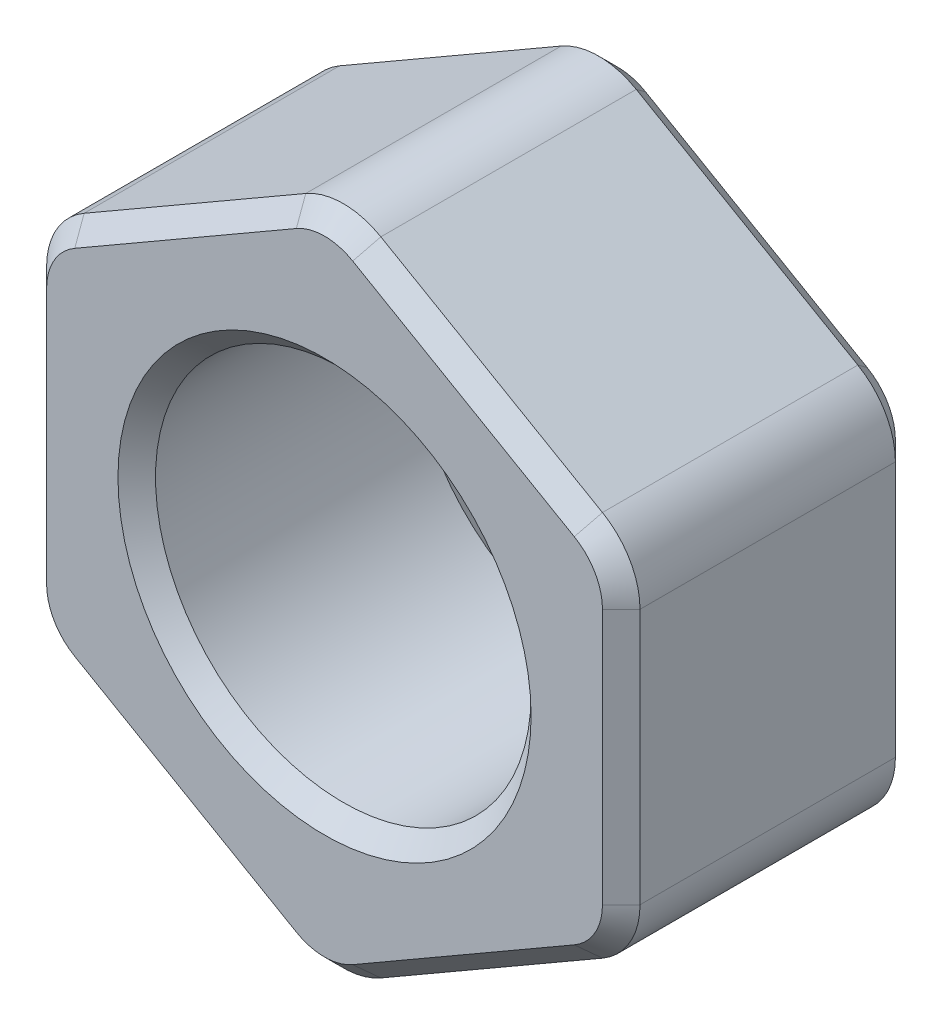
ISO-10303-21;
HEADER;
FILE_DESCRIPTION(('STEP AP214'),'2;1');
FILE_NAME('part.step','',(''),(''),'','','');
FILE_SCHEMA(('AUTOMOTIVE_DESIGN { 1 0 10303 214 1 1 1 1 }'));
ENDSEC;
DATA;
#1=APPLICATION_CONTEXT('core data for automotive mechanical design processes');
#2=APPLICATION_PROTOCOL_DEFINITION('international standard','automotive_design',2000,#1);
#3=PRODUCT_CONTEXT('',#1,'mechanical');
#4=PRODUCT('Part','Part','',(#3));
#5=PRODUCT_RELATED_PRODUCT_CATEGORY('part','',(#4));
#6=PRODUCT_DEFINITION_FORMATION('','',#4);
#7=PRODUCT_DEFINITION_CONTEXT('part definition',#1,'design');
#8=PRODUCT_DEFINITION('design','',#6,#7);
#9=PRODUCT_DEFINITION_SHAPE('','',#8);
#10=(LENGTH_UNIT() NAMED_UNIT(*) SI_UNIT(.MILLI.,.METRE.));
#11=(NAMED_UNIT(*) PLANE_ANGLE_UNIT() SI_UNIT($,.RADIAN.));
#12=(NAMED_UNIT(*) SI_UNIT($,.STERADIAN.) SOLID_ANGLE_UNIT());
#13=UNCERTAINTY_MEASURE_WITH_UNIT(LENGTH_MEASURE(1.E-05),#10,'distance_accuracy_value','');
#14=(GEOMETRIC_REPRESENTATION_CONTEXT(3) GLOBAL_UNCERTAINTY_ASSIGNED_CONTEXT((#13)) GLOBAL_UNIT_ASSIGNED_CONTEXT((#10,
#11,#12)) REPRESENTATION_CONTEXT('',''));
#15=CARTESIAN_POINT('',(0.,0.,0.));
#16=DIRECTION('',(0.,0.,1.));
#17=DIRECTION('',(1.,0.,0.));
#18=AXIS2_PLACEMENT_3D('',#15,#16,#17);
#19=CARTESIAN_POINT('',(0.,0.,3.9));
#20=DIRECTION('',(0.,0.,1.));
#21=DIRECTION('',(1.,0.,0.));
#22=AXIS2_PLACEMENT_3D('',#19,#20,#21);
#23=PLANE('',#22);
#24=CARTESIAN_POINT('',(0.,0.,3.9));
#25=DIRECTION('',(0.,0.,1.));
#26=DIRECTION('',(1.,0.,0.));
#27=AXIS2_PLACEMENT_3D('',#24,#25,#26);
#28=CIRCLE('',#27,2.75);
#29=CARTESIAN_POINT('',(2.75,0.,3.9));
#30=VERTEX_POINT('',#29);
#31=EDGE_CURVE('E385',#30,#30,#28,.F.);
#32=ORIENTED_EDGE('',*,*,#31,.T.);
#33=EDGE_LOOP('',(#32));
#34=FACE_BOUND('',#33,.T.);
#35=CARTESIAN_POINT('',(-2.95,-1.70318329410939,3.9));
#36=DIRECTION('',(0.,0.,1.));
#37=DIRECTION('',(1.,0.,0.));
#38=AXIS2_PLACEMENT_3D('',#35,#36,#37);
#39=CIRCLE('',#38,0.749999999999999);
#40=CARTESIAN_POINT('',(-3.69999999999999,-1.70318329410939,3.9));
#41=VERTEX_POINT('',#40);
#42=CARTESIAN_POINT('',(-3.32499999999999,-2.35270234694772,3.9));
#43=VERTEX_POINT('',#42);
#44=EDGE_CURVE('E395',#41,#43,#39,.T.);
#45=ORIENTED_EDGE('',*,*,#44,.T.);
#46=DIRECTION('',(0.866025403784439,-0.499999999999999,0.));
#47=VECTOR('',#46,1.);
#48=CARTESIAN_POINT('',(-0.374999999999998,-4.05588564105711,3.9));
#49=LINE('',#48,#47);
#50=CARTESIAN_POINT('',(-0.374999999999998,-4.05588564105711,3.9));
#51=VERTEX_POINT('',#50);
#52=EDGE_CURVE('E389',#43,#51,#49,.T.);
#53=ORIENTED_EDGE('',*,*,#52,.T.);
#54=CARTESIAN_POINT('',(0.,-3.40636658821878,3.9));
#55=DIRECTION('',(0.,0.,1.));
#56=DIRECTION('',(1.,0.,0.));
#57=AXIS2_PLACEMENT_3D('',#54,#55,#56);
#58=CIRCLE('',#57,0.749999999999999);
#59=CARTESIAN_POINT('',(0.374999999999999,-4.05588564105711,3.9));
#60=VERTEX_POINT('',#59);
#61=EDGE_CURVE('E393',#51,#60,#58,.T.);
#62=ORIENTED_EDGE('',*,*,#61,.T.);
#63=DIRECTION('',(0.86602540378444,0.499999999999998,0.));
#64=VECTOR('',#63,1.);
#65=CARTESIAN_POINT('',(3.325,-2.35270234694772,3.9));
#66=LINE('',#65,#64);
#67=CARTESIAN_POINT('',(3.325,-2.35270234694772,3.9));
#68=VERTEX_POINT('',#67);
#69=EDGE_CURVE('E397',#60,#68,#66,.T.);
#70=ORIENTED_EDGE('',*,*,#69,.T.);
#71=CARTESIAN_POINT('',(2.95,-1.70318329410939,3.9));
#72=DIRECTION('',(0.,0.,1.));
#73=DIRECTION('',(1.,0.,0.));
#74=AXIS2_PLACEMENT_3D('',#71,#72,#73);
#75=CIRCLE('',#74,0.749999999999999);
#76=CARTESIAN_POINT('',(3.7,-1.70318329410939,3.9));
#77=VERTEX_POINT('',#76);
#78=EDGE_CURVE('E402',#68,#77,#75,.T.);
#79=ORIENTED_EDGE('',*,*,#78,.T.);
#80=DIRECTION('',(0.,1.,0.));
#81=VECTOR('',#80,1.);
#82=CARTESIAN_POINT('',(3.7,1.70318329410939,3.9));
#83=LINE('',#82,#81);
#84=CARTESIAN_POINT('',(3.7,1.70318329410939,3.9));
#85=VERTEX_POINT('',#84);
#86=EDGE_CURVE('E406',#77,#85,#83,.T.);
#87=ORIENTED_EDGE('',*,*,#86,.T.);
#88=CARTESIAN_POINT('',(2.95,1.70318329410939,3.9));
#89=DIRECTION('',(0.,0.,1.));
#90=DIRECTION('',(1.,0.,0.));
#91=AXIS2_PLACEMENT_3D('',#88,#89,#90);
#92=CIRCLE('',#91,0.749999999999999);
#93=CARTESIAN_POINT('',(3.325,2.35270234694772,3.9));
#94=VERTEX_POINT('',#93);
#95=EDGE_CURVE('E341',#85,#94,#92,.T.);
#96=ORIENTED_EDGE('',*,*,#95,.T.);
#97=DIRECTION('',(-0.86602540378444,0.499999999999998,0.));
#98=VECTOR('',#97,1.);
#99=CARTESIAN_POINT('',(0.374999999999999,4.05588564105711,3.9));
#100=LINE('',#99,#98);
#101=CARTESIAN_POINT('',(0.374999999999999,4.05588564105711,3.9));
#102=VERTEX_POINT('',#101);
#103=EDGE_CURVE('E337',#94,#102,#100,.T.);
#104=ORIENTED_EDGE('',*,*,#103,.T.);
#105=CARTESIAN_POINT('',(0.,3.40636658821878,3.9));
#106=DIRECTION('',(0.,0.,1.));
#107=DIRECTION('',(1.,0.,0.));
#108=AXIS2_PLACEMENT_3D('',#105,#106,#107);
#109=CIRCLE('',#108,0.749999999999999);
#110=CARTESIAN_POINT('',(-0.374999999999998,4.05588564105711,3.9));
#111=VERTEX_POINT('',#110);
#112=EDGE_CURVE('E411',#102,#111,#109,.T.);
#113=ORIENTED_EDGE('',*,*,#112,.T.);
#114=DIRECTION('',(-0.86602540378444,-0.499999999999998,0.));
#115=VECTOR('',#114,1.);
#116=CARTESIAN_POINT('',(-3.325,2.35270234694772,3.9));
#117=LINE('',#116,#115);
#118=CARTESIAN_POINT('',(-3.325,2.35270234694772,3.9));
#119=VERTEX_POINT('',#118);
#120=EDGE_CURVE('E408',#111,#119,#117,.T.);
#121=ORIENTED_EDGE('',*,*,#120,.T.);
#122=CARTESIAN_POINT('',(-2.95,1.70318329410939,3.9));
#123=DIRECTION('',(0.,0.,1.));
#124=DIRECTION('',(1.,0.,0.));
#125=AXIS2_PLACEMENT_3D('',#122,#123,#124);
#126=CIRCLE('',#125,0.749999999999999);
#127=CARTESIAN_POINT('',(-3.7,1.70318329410939,3.9));
#128=VERTEX_POINT('',#127);
#129=EDGE_CURVE('E404',#119,#128,#126,.T.);
#130=ORIENTED_EDGE('',*,*,#129,.T.);
#131=DIRECTION('',(0.,-1.,0.));
#132=VECTOR('',#131,1.);
#133=CARTESIAN_POINT('',(-3.69999999999999,-1.70318329410939,3.9));
#134=LINE('',#133,#132);
#135=EDGE_CURVE('E400',#128,#41,#134,.T.);
#136=ORIENTED_EDGE('',*,*,#135,.T.);
#137=EDGE_LOOP('',(#45,#53,#62,#70,#79,#87,#96,#104,#113,#121,#130,#136));
#138=FACE_BOUND('',#137,.T.);
#139=ADVANCED_FACE('F38',(#34,#138),#23,.T.);
#140=CARTESIAN_POINT('',(0.,0.,0.));
#141=DIRECTION('',(0.,0.,1.));
#142=DIRECTION('',(1.,0.,0.));
#143=AXIS2_PLACEMENT_3D('',#140,#141,#142);
#144=PLANE('',#143);
#145=CARTESIAN_POINT('',(0.,0.,0.));
#146=DIRECTION('',(0.,0.,1.));
#147=DIRECTION('',(1.,0.,0.));
#148=AXIS2_PLACEMENT_3D('',#145,#146,#147);
#149=CIRCLE('',#148,2.75);
#150=CARTESIAN_POINT('',(2.75,0.,0.));
#151=VERTEX_POINT('',#150);
#152=EDGE_CURVE('E422',#151,#151,#149,.T.);
#153=ORIENTED_EDGE('',*,*,#152,.T.);
#154=EDGE_LOOP('',(#153));
#155=FACE_BOUND('',#154,.T.);
#156=CARTESIAN_POINT('',(0.,-3.40636658821878,0.));
#157=DIRECTION('',(0.,0.,1.));
#158=DIRECTION('',(1.,0.,0.));
#159=AXIS2_PLACEMENT_3D('',#156,#157,#158);
#160=CIRCLE('',#159,0.75);
#161=CARTESIAN_POINT('',(0.374999999999999,-4.05588564105711,0.));
#162=VERTEX_POINT('',#161);
#163=CARTESIAN_POINT('',(-0.374999999999999,-4.05588564105711,0.));
#164=VERTEX_POINT('',#163);
#165=EDGE_CURVE('E428',#162,#164,#160,.F.);
#166=ORIENTED_EDGE('',*,*,#165,.T.);
#167=DIRECTION('',(-0.866025403784439,0.499999999999999,0.));
#168=VECTOR('',#167,1.);
#169=CARTESIAN_POINT('',(-1.84999999999999,-3.20429399400242,0.));
#170=LINE('',#169,#168);
#171=CARTESIAN_POINT('',(-3.32499999999999,-2.35270234694772,0.));
#172=VERTEX_POINT('',#171);
#173=EDGE_CURVE('E425',#164,#172,#170,.T.);
#174=ORIENTED_EDGE('',*,*,#173,.T.);
#175=CARTESIAN_POINT('',(-2.95,-1.70318329410939,0.));
#176=DIRECTION('',(0.,0.,1.));
#177=DIRECTION('',(1.,0.,0.));
#178=AXIS2_PLACEMENT_3D('',#175,#176,#177);
#179=CIRCLE('',#178,0.75);
#180=CARTESIAN_POINT('',(-3.7,-1.70318329410939,0.));
#181=VERTEX_POINT('',#180);
#182=EDGE_CURVE('E430',#172,#181,#179,.F.);
#183=ORIENTED_EDGE('',*,*,#182,.T.);
#184=DIRECTION('',(0.,1.,0.));
#185=VECTOR('',#184,1.);
#186=CARTESIAN_POINT('',(-3.7,0.,0.));
#187=LINE('',#186,#185);
#188=CARTESIAN_POINT('',(-3.7,1.70318329410939,0.));
#189=VERTEX_POINT('',#188);
#190=EDGE_CURVE('E434',#181,#189,#187,.T.);
#191=ORIENTED_EDGE('',*,*,#190,.T.);
#192=CARTESIAN_POINT('',(-2.95,1.70318329410939,0.));
#193=DIRECTION('',(0.,0.,1.));
#194=DIRECTION('',(1.,0.,0.));
#195=AXIS2_PLACEMENT_3D('',#192,#193,#194);
#196=CIRCLE('',#195,0.75);
#197=CARTESIAN_POINT('',(-3.325,2.35270234694772,0.));
#198=VERTEX_POINT('',#197);
#199=EDGE_CURVE('E439',#189,#198,#196,.F.);
#200=ORIENTED_EDGE('',*,*,#199,.T.);
#201=DIRECTION('',(0.86602540378444,0.499999999999998,0.));
#202=VECTOR('',#201,1.);
#203=CARTESIAN_POINT('',(-1.84999999999999,3.20429399400242,0.));
#204=LINE('',#203,#202);
#205=CARTESIAN_POINT('',(-0.374999999999998,4.05588564105711,0.));
#206=VERTEX_POINT('',#205);
#207=EDGE_CURVE('E208',#198,#206,#204,.T.);
#208=ORIENTED_EDGE('',*,*,#207,.T.);
#209=CARTESIAN_POINT('',(0.,3.40636658821878,0.));
#210=DIRECTION('',(0.,0.,1.));
#211=DIRECTION('',(1.,0.,0.));
#212=AXIS2_PLACEMENT_3D('',#209,#210,#211);
#213=CIRCLE('',#212,0.75);
#214=CARTESIAN_POINT('',(0.374999999999999,4.05588564105711,0.));
#215=VERTEX_POINT('',#214);
#216=EDGE_CURVE('E202',#206,#215,#213,.F.);
#217=ORIENTED_EDGE('',*,*,#216,.T.);
#218=DIRECTION('',(0.86602540378444,-0.499999999999998,0.));
#219=VECTOR('',#218,1.);
#220=CARTESIAN_POINT('',(1.84999999999999,3.20429399400242,0.));
#221=LINE('',#220,#219);
#222=CARTESIAN_POINT('',(3.325,2.35270234694772,0.));
#223=VERTEX_POINT('',#222);
#224=EDGE_CURVE('E205',#215,#223,#221,.T.);
#225=ORIENTED_EDGE('',*,*,#224,.T.);
#226=CARTESIAN_POINT('',(2.95,1.70318329410939,0.));
#227=DIRECTION('',(0.,0.,1.));
#228=DIRECTION('',(1.,0.,0.));
#229=AXIS2_PLACEMENT_3D('',#226,#227,#228);
#230=CIRCLE('',#229,0.75);
#231=CARTESIAN_POINT('',(3.7,1.70318329410939,0.));
#232=VERTEX_POINT('',#231);
#233=EDGE_CURVE('E213',#223,#232,#230,.F.);
#234=ORIENTED_EDGE('',*,*,#233,.T.);
#235=DIRECTION('',(0.,-1.,0.));
#236=VECTOR('',#235,1.);
#237=CARTESIAN_POINT('',(3.7,0.,0.));
#238=LINE('',#237,#236);
#239=CARTESIAN_POINT('',(3.7,-1.70318329410939,0.));
#240=VERTEX_POINT('',#239);
#241=EDGE_CURVE('E441',#232,#240,#238,.T.);
#242=ORIENTED_EDGE('',*,*,#241,.T.);
#243=CARTESIAN_POINT('',(2.95,-1.70318329410939,0.));
#244=DIRECTION('',(0.,0.,1.));
#245=DIRECTION('',(1.,0.,0.));
#246=AXIS2_PLACEMENT_3D('',#243,#244,#245);
#247=CIRCLE('',#246,0.75);
#248=CARTESIAN_POINT('',(3.325,-2.35270234694772,0.));
#249=VERTEX_POINT('',#248);
#250=EDGE_CURVE('E436',#240,#249,#247,.F.);
#251=ORIENTED_EDGE('',*,*,#250,.T.);
#252=DIRECTION('',(-0.86602540378444,-0.499999999999998,0.));
#253=VECTOR('',#252,1.);
#254=CARTESIAN_POINT('',(1.84999999999999,-3.20429399400242,0.));
#255=LINE('',#254,#253);
#256=EDGE_CURVE('E432',#249,#162,#255,.T.);
#257=ORIENTED_EDGE('',*,*,#256,.T.);
#258=EDGE_LOOP('',(#166,#174,#183,#191,#200,#208,#217,#225,#234,#242,#251,#257));
#259=FACE_BOUND('',#258,.T.);
#260=ADVANCED_FACE('F204',(#155,#259),#144,.F.);
#261=CARTESIAN_POINT('',(0.,4.56106712659803,3.9));
#262=DIRECTION('',(0.499999999999998,-0.86602540378444,0.));
#263=DIRECTION('',(0.86602540378444,0.499999999999998,0.));
#264=AXIS2_PLACEMENT_3D('',#261,#262,#263);
#265=PLANE('',#264);
#266=DIRECTION('',(0.,0.,-1.));
#267=VECTOR('',#266,1.);
#268=CARTESIAN_POINT('',(-0.499999999999998,4.27239199200322,3.9));
#269=LINE('',#268,#267);
#270=CARTESIAN_POINT('',(-0.499999999999998,4.27239199200322,3.65));
#271=VERTEX_POINT('',#270);
#272=CARTESIAN_POINT('',(-0.499999999999998,4.27239199200322,0.249999999999999));
#273=VERTEX_POINT('',#272);
#274=EDGE_CURVE('E446',#271,#273,#269,.T.);
#275=ORIENTED_EDGE('',*,*,#274,.T.);
#276=DIRECTION('',(-0.86602540378444,-0.499999999999998,0.));
#277=VECTOR('',#276,1.);
#278=CARTESIAN_POINT('',(0.,4.56106712659803,0.249999999999998));
#279=LINE('',#278,#277);
#280=CARTESIAN_POINT('',(-3.45,2.56920869789383,0.249999999999998));
#281=VERTEX_POINT('',#280);
#282=EDGE_CURVE('E308',#273,#281,#279,.T.);
#283=ORIENTED_EDGE('',*,*,#282,.T.);
#284=DIRECTION('',(0.,0.,-1.));
#285=VECTOR('',#284,1.);
#286=CARTESIAN_POINT('',(-3.45,2.56920869789383,3.9));
#287=LINE('',#286,#285);
#288=CARTESIAN_POINT('',(-3.45,2.56920869789383,3.65));
#289=VERTEX_POINT('',#288);
#290=EDGE_CURVE('E223',#281,#289,#287,.F.);
#291=ORIENTED_EDGE('',*,*,#290,.T.);
#292=DIRECTION('',(0.86602540378444,0.499999999999998,0.));
#293=VECTOR('',#292,1.);
#294=CARTESIAN_POINT('',(-0.499999999999998,4.27239199200322,3.65));
#295=LINE('',#294,#293);
#296=EDGE_CURVE('E315',#289,#271,#295,.T.);
#297=ORIENTED_EDGE('',*,*,#296,.T.);
#298=EDGE_LOOP('',(#275,#283,#291,#297));
#299=FACE_BOUND('',#298,.T.);
#300=ADVANCED_FACE('F500',(#299),#265,.F.);
#301=CARTESIAN_POINT('',(-3.95,2.28053356329902,3.9));
#302=DIRECTION('',(1.,0.,0.));
#303=DIRECTION('',(0.,1.,0.));
#304=AXIS2_PLACEMENT_3D('',#301,#302,#303);
#305=PLANE('',#304);
#306=DIRECTION('',(0.,0.,-1.));
#307=VECTOR('',#306,1.);
#308=CARTESIAN_POINT('',(-3.95,1.70318329410939,3.9));
#309=LINE('',#308,#307);
#310=CARTESIAN_POINT('',(-3.95,1.70318329410939,3.65));
#311=VERTEX_POINT('',#310);
#312=CARTESIAN_POINT('',(-3.95,1.70318329410939,0.249999999999999));
#313=VERTEX_POINT('',#312);
#314=EDGE_CURVE('E451',#311,#313,#309,.T.);
#315=ORIENTED_EDGE('',*,*,#314,.T.);
#316=DIRECTION('',(0.,-1.,0.));
#317=VECTOR('',#316,1.);
#318=CARTESIAN_POINT('',(-3.95,2.28053356329902,0.249999999999999));
#319=LINE('',#318,#317);
#320=CARTESIAN_POINT('',(-3.95,-1.70318329410939,0.249999999999999));
#321=VERTEX_POINT('',#320);
#322=EDGE_CURVE('E363',#313,#321,#319,.T.);
#323=ORIENTED_EDGE('',*,*,#322,.T.);
#324=DIRECTION('',(0.,0.,-1.));
#325=VECTOR('',#324,1.);
#326=CARTESIAN_POINT('',(-3.95,-1.70318329410939,3.9));
#327=LINE('',#326,#325);
#328=CARTESIAN_POINT('',(-3.95,-1.70318329410939,3.65));
#329=VERTEX_POINT('',#328);
#330=EDGE_CURVE('E448',#321,#329,#327,.F.);
#331=ORIENTED_EDGE('',*,*,#330,.T.);
#332=DIRECTION('',(0.,1.,0.));
#333=VECTOR('',#332,1.);
#334=CARTESIAN_POINT('',(-3.95,1.70318329410939,3.65));
#335=LINE('',#334,#333);
#336=EDGE_CURVE('E365',#329,#311,#335,.T.);
#337=ORIENTED_EDGE('',*,*,#336,.T.);
#338=EDGE_LOOP('',(#315,#323,#331,#337));
#339=FACE_BOUND('',#338,.T.);
#340=ADVANCED_FACE('F518',(#339),#305,.F.);
#341=CARTESIAN_POINT('',(0.,-4.56106712659803,3.9));
#342=DIRECTION('',(0.499999999999999,0.866025403784439,0.));
#343=DIRECTION('',(-0.866025403784439,0.499999999999999,0.));
#344=AXIS2_PLACEMENT_3D('',#341,#342,#343);
#345=PLANE('',#344);
#346=DIRECTION('',(0.,0.,-1.));
#347=VECTOR('',#346,1.);
#348=CARTESIAN_POINT('',(-3.44999999999999,-2.56920869789383,3.9));
#349=LINE('',#348,#347);
#350=CARTESIAN_POINT('',(-3.44999999999999,-2.56920869789383,3.65));
#351=VERTEX_POINT('',#350);
#352=CARTESIAN_POINT('',(-3.44999999999999,-2.56920869789383,0.249999999999999));
#353=VERTEX_POINT('',#352);
#354=EDGE_CURVE('E457',#351,#353,#349,.T.);
#355=ORIENTED_EDGE('',*,*,#354,.T.);
#356=DIRECTION('',(0.866025403784439,-0.499999999999999,0.));
#357=VECTOR('',#356,1.);
#358=CARTESIAN_POINT('',(0.,-4.56106712659803,0.249999999999999));
#359=LINE('',#358,#357);
#360=CARTESIAN_POINT('',(-0.499999999999999,-4.27239199200322,0.249999999999999));
#361=VERTEX_POINT('',#360);
#362=EDGE_CURVE('E379',#353,#361,#359,.T.);
#363=ORIENTED_EDGE('',*,*,#362,.T.);
#364=DIRECTION('',(0.,0.,-1.));
#365=VECTOR('',#364,1.);
#366=CARTESIAN_POINT('',(-0.499999999999999,-4.27239199200322,3.9));
#367=LINE('',#366,#365);
#368=CARTESIAN_POINT('',(-0.499999999999999,-4.27239199200322,3.65));
#369=VERTEX_POINT('',#368);
#370=EDGE_CURVE('E454',#361,#369,#367,.F.);
#371=ORIENTED_EDGE('',*,*,#370,.T.);
#372=DIRECTION('',(-0.866025403784439,0.499999999999999,0.));
#373=VECTOR('',#372,1.);
#374=CARTESIAN_POINT('',(-3.45,-2.56920869789383,3.65));
#375=LINE('',#374,#373);
#376=EDGE_CURVE('E382',#369,#351,#375,.T.);
#377=ORIENTED_EDGE('',*,*,#376,.T.);
#378=EDGE_LOOP('',(#355,#363,#371,#377));
#379=FACE_BOUND('',#378,.T.);
#380=ADVANCED_FACE('F514',(#379),#345,.F.);
#381=CARTESIAN_POINT('',(0.,-4.56106712659803,3.9));
#382=DIRECTION('',(-0.499999999999998,0.86602540378444,0.));
#383=DIRECTION('',(-0.86602540378444,-0.499999999999998,0.));
#384=AXIS2_PLACEMENT_3D('',#381,#382,#383);
#385=PLANE('',#384);
#386=DIRECTION('',(0.,0.,-1.));
#387=VECTOR('',#386,1.);
#388=CARTESIAN_POINT('',(0.499999999999999,-4.27239199200322,3.9));
#389=LINE('',#388,#387);
#390=CARTESIAN_POINT('',(0.499999999999999,-4.27239199200322,3.65));
#391=VERTEX_POINT('',#390);
#392=CARTESIAN_POINT('',(0.499999999999999,-4.27239199200322,0.249999999999999));
#393=VERTEX_POINT('',#392);
#394=EDGE_CURVE('E463',#391,#393,#389,.T.);
#395=ORIENTED_EDGE('',*,*,#394,.T.);
#396=DIRECTION('',(0.86602540378444,0.499999999999998,0.));
#397=VECTOR('',#396,1.);
#398=CARTESIAN_POINT('',(0.,-4.56106712659803,0.249999999999999));
#399=LINE('',#398,#397);
#400=CARTESIAN_POINT('',(3.45,-2.56920869789383,0.249999999999999));
#401=VERTEX_POINT('',#400);
#402=EDGE_CURVE('E367',#393,#401,#399,.T.);
#403=ORIENTED_EDGE('',*,*,#402,.T.);
#404=DIRECTION('',(0.,0.,-1.));
#405=VECTOR('',#404,1.);
#406=CARTESIAN_POINT('',(3.45,-2.56920869789383,3.9));
#407=LINE('',#406,#405);
#408=CARTESIAN_POINT('',(3.45,-2.56920869789383,3.65));
#409=VERTEX_POINT('',#408);
#410=EDGE_CURVE('E460',#401,#409,#407,.F.);
#411=ORIENTED_EDGE('',*,*,#410,.T.);
#412=DIRECTION('',(-0.86602540378444,-0.499999999999998,0.));
#413=VECTOR('',#412,1.);
#414=CARTESIAN_POINT('',(0.499999999999999,-4.27239199200322,3.65));
#415=LINE('',#414,#413);
#416=EDGE_CURVE('E369',#409,#391,#415,.T.);
#417=ORIENTED_EDGE('',*,*,#416,.T.);
#418=EDGE_LOOP('',(#395,#403,#411,#417));
#419=FACE_BOUND('',#418,.T.);
#420=ADVANCED_FACE('F511',(#419),#385,.F.);
#421=CARTESIAN_POINT('',(3.95,2.28053356329902,3.9));
#422=DIRECTION('',(-1.,0.,0.));
#423=DIRECTION('',(0.,-1.,0.));
#424=AXIS2_PLACEMENT_3D('',#421,#422,#423);
#425=PLANE('',#424);
#426=DIRECTION('',(0.,0.,-1.));
#427=VECTOR('',#426,1.);
#428=CARTESIAN_POINT('',(3.95,-1.70318329410939,3.9));
#429=LINE('',#428,#427);
#430=CARTESIAN_POINT('',(3.95,-1.70318329410939,3.65));
#431=VERTEX_POINT('',#430);
#432=CARTESIAN_POINT('',(3.95,-1.70318329410939,0.249999999999999));
#433=VERTEX_POINT('',#432);
#434=EDGE_CURVE('E334',#431,#433,#429,.T.);
#435=ORIENTED_EDGE('',*,*,#434,.T.);
#436=DIRECTION('',(0.,1.,0.));
#437=VECTOR('',#436,1.);
#438=CARTESIAN_POINT('',(3.95,2.28053356329902,0.249999999999999));
#439=LINE('',#438,#437);
#440=CARTESIAN_POINT('',(3.95,1.70318329410939,0.249999999999999));
#441=VERTEX_POINT('',#440);
#442=EDGE_CURVE('E319',#433,#441,#439,.T.);
#443=ORIENTED_EDGE('',*,*,#442,.T.);
#444=DIRECTION('',(0.,0.,-1.));
#445=VECTOR('',#444,1.);
#446=CARTESIAN_POINT('',(3.95,1.70318329410939,3.9));
#447=LINE('',#446,#445);
#448=CARTESIAN_POINT('',(3.95,1.70318329410939,3.65));
#449=VERTEX_POINT('',#448);
#450=EDGE_CURVE('E466',#441,#449,#447,.F.);
#451=ORIENTED_EDGE('',*,*,#450,.T.);
#452=DIRECTION('',(0.,-1.,0.));
#453=VECTOR('',#452,1.);
#454=CARTESIAN_POINT('',(3.95,-1.70318329410939,3.65));
#455=LINE('',#454,#453);
#456=EDGE_CURVE('E345',#449,#431,#455,.T.);
#457=ORIENTED_EDGE('',*,*,#456,.T.);
#458=EDGE_LOOP('',(#435,#443,#451,#457));
#459=FACE_BOUND('',#458,.T.);
#460=ADVANCED_FACE('F469',(#459),#425,.F.);
#461=CARTESIAN_POINT('',(0.,4.56106712659803,3.9));
#462=DIRECTION('',(-0.499999999999998,-0.866025403784439,0.));
#463=DIRECTION('',(0.86602540378444,-0.499999999999998,0.));
#464=AXIS2_PLACEMENT_3D('',#461,#462,#463);
#465=PLANE('',#464);
#466=DIRECTION('',(0.,0.,-1.));
#467=VECTOR('',#466,1.);
#468=CARTESIAN_POINT('',(3.45,2.56920869789383,3.9));
#469=LINE('',#468,#467);
#470=CARTESIAN_POINT('',(3.45,2.56920869789383,3.65));
#471=VERTEX_POINT('',#470);
#472=CARTESIAN_POINT('',(3.45,2.56920869789383,0.249999999999999));
#473=VERTEX_POINT('',#472);
#474=EDGE_CURVE('E230',#471,#473,#469,.T.);
#475=ORIENTED_EDGE('',*,*,#474,.T.);
#476=DIRECTION('',(-0.86602540378444,0.499999999999998,0.));
#477=VECTOR('',#476,1.);
#478=CARTESIAN_POINT('',(0.,4.56106712659803,0.249999999999999));
#479=LINE('',#478,#477);
#480=CARTESIAN_POINT('',(0.499999999999999,4.27239199200322,0.249999999999999));
#481=VERTEX_POINT('',#480);
#482=EDGE_CURVE('E11',#473,#481,#479,.T.);
#483=ORIENTED_EDGE('',*,*,#482,.T.);
#484=DIRECTION('',(0.,0.,-1.));
#485=VECTOR('',#484,1.);
#486=CARTESIAN_POINT('',(0.499999999999999,4.27239199200322,3.9));
#487=LINE('',#486,#485);
#488=CARTESIAN_POINT('',(0.499999999999999,4.27239199200322,3.65));
#489=VERTEX_POINT('',#488);
#490=EDGE_CURVE('E227',#481,#489,#487,.F.);
#491=ORIENTED_EDGE('',*,*,#490,.T.);
#492=DIRECTION('',(0.86602540378444,-0.499999999999998,0.));
#493=VECTOR('',#492,1.);
#494=CARTESIAN_POINT('',(3.45,2.56920869789383,3.65));
#495=LINE('',#494,#493);
#496=EDGE_CURVE('E49',#489,#471,#495,.T.);
#497=ORIENTED_EDGE('',*,*,#496,.T.);
#498=EDGE_LOOP('',(#475,#483,#491,#497));
#499=FACE_BOUND('',#498,.T.);
#500=ADVANCED_FACE('F327',(#499),#465,.F.);
#501=CARTESIAN_POINT('',(0.,0.,3.9));
#502=DIRECTION('',(0.,0.,-1.));
#503=DIRECTION('',(-1.,0.,0.));
#504=AXIS2_PLACEMENT_3D('',#501,#502,#503);
#505=CYLINDRICAL_SURFACE('',#504,2.5);
#506=CARTESIAN_POINT('',(0.,0.,0.250000000000001));
#507=DIRECTION('',(0.,0.,1.));
#508=DIRECTION('',(1.,0.,0.));
#509=AXIS2_PLACEMENT_3D('',#506,#507,#508);
#510=CIRCLE('',#509,2.5);
#511=CARTESIAN_POINT('',(2.5,0.,0.250000000000001));
#512=VERTEX_POINT('',#511);
#513=EDGE_CURVE('E415',#512,#512,#510,.F.);
#514=ORIENTED_EDGE('',*,*,#513,.T.);
#515=EDGE_LOOP('',(#514));
#516=FACE_BOUND('',#515,.T.);
#517=CARTESIAN_POINT('',(0.,0.,3.65));
#518=DIRECTION('',(0.,0.,1.));
#519=DIRECTION('',(1.,0.,0.));
#520=AXIS2_PLACEMENT_3D('',#517,#518,#519);
#521=CIRCLE('',#520,2.5);
#522=CARTESIAN_POINT('',(2.5,0.,3.65));
#523=VERTEX_POINT('',#522);
#524=EDGE_CURVE('E418',#523,#523,#521,.T.);
#525=ORIENTED_EDGE('',*,*,#524,.T.);
#526=EDGE_LOOP('',(#525));
#527=FACE_BOUND('',#526,.T.);
#528=ADVANCED_FACE('F505',(#516,#527),#505,.F.);
#529=CARTESIAN_POINT('',(2.95,1.70318329410939,3.9));
#530=DIRECTION('',(0.,0.,-1.));
#531=DIRECTION('',(-1.,0.,0.));
#532=AXIS2_PLACEMENT_3D('',#529,#530,#531);
#533=CYLINDRICAL_SURFACE('',#532,1.);
#534=ORIENTED_EDGE('',*,*,#450,.F.);
#535=CARTESIAN_POINT('',(2.95,1.70318329410939,0.249999999999999));
#536=DIRECTION('',(0.,0.,1.));
#537=DIRECTION('',(1.,0.,0.));
#538=AXIS2_PLACEMENT_3D('',#535,#536,#537);
#539=CIRCLE('',#538,1.);
#540=EDGE_CURVE('E317',#441,#473,#539,.T.);
#541=ORIENTED_EDGE('',*,*,#540,.T.);
#542=ORIENTED_EDGE('',*,*,#474,.F.);
#543=CARTESIAN_POINT('',(2.95,1.70318329410939,3.65));
#544=DIRECTION('',(0.,0.,1.));
#545=DIRECTION('',(1.,0.,0.));
#546=AXIS2_PLACEMENT_3D('',#543,#544,#545);
#547=CIRCLE('',#546,1.);
#548=EDGE_CURVE('E314',#471,#449,#547,.F.);
#549=ORIENTED_EDGE('',*,*,#548,.T.);
#550=EDGE_LOOP('',(#534,#541,#542,#549));
#551=FACE_BOUND('',#550,.T.);
#552=ADVANCED_FACE('F331',(#551),#533,.T.);
#553=CARTESIAN_POINT('',(2.95,-1.70318329410939,3.9));
#554=DIRECTION('',(0.,0.,-1.));
#555=DIRECTION('',(-1.,0.,0.));
#556=AXIS2_PLACEMENT_3D('',#553,#554,#555);
#557=CYLINDRICAL_SURFACE('',#556,1.);
#558=ORIENTED_EDGE('',*,*,#410,.F.);
#559=CARTESIAN_POINT('',(2.95,-1.70318329410939,0.249999999999999));
#560=DIRECTION('',(0.,0.,1.));
#561=DIRECTION('',(1.,0.,0.));
#562=AXIS2_PLACEMENT_3D('',#559,#560,#561);
#563=CIRCLE('',#562,1.);
#564=EDGE_CURVE('E358',#401,#433,#563,.T.);
#565=ORIENTED_EDGE('',*,*,#564,.T.);
#566=ORIENTED_EDGE('',*,*,#434,.F.);
#567=CARTESIAN_POINT('',(2.95,-1.70318329410939,3.65));
#568=DIRECTION('',(0.,0.,1.));
#569=DIRECTION('',(1.,0.,0.));
#570=AXIS2_PLACEMENT_3D('',#567,#568,#569);
#571=CIRCLE('',#570,1.);
#572=EDGE_CURVE('E360',#431,#409,#571,.F.);
#573=ORIENTED_EDGE('',*,*,#572,.T.);
#574=EDGE_LOOP('',(#558,#565,#566,#573));
#575=FACE_BOUND('',#574,.T.);
#576=ADVANCED_FACE('F527',(#575),#557,.T.);
#577=CARTESIAN_POINT('',(0.,-3.40636658821878,3.9));
#578=DIRECTION('',(0.,0.,-1.));
#579=DIRECTION('',(-1.,0.,0.));
#580=AXIS2_PLACEMENT_3D('',#577,#578,#579);
#581=CYLINDRICAL_SURFACE('',#580,1.);
#582=ORIENTED_EDGE('',*,*,#370,.F.);
#583=CARTESIAN_POINT('',(0.,-3.40636658821878,0.249999999999999));
#584=DIRECTION('',(0.,0.,1.));
#585=DIRECTION('',(1.,0.,0.));
#586=AXIS2_PLACEMENT_3D('',#583,#584,#585);
#587=CIRCLE('',#586,1.);
#588=EDGE_CURVE('E375',#361,#393,#587,.T.);
#589=ORIENTED_EDGE('',*,*,#588,.T.);
#590=ORIENTED_EDGE('',*,*,#394,.F.);
#591=CARTESIAN_POINT('',(0.,-3.40636658821878,3.65));
#592=DIRECTION('',(0.,0.,1.));
#593=DIRECTION('',(1.,0.,0.));
#594=AXIS2_PLACEMENT_3D('',#591,#592,#593);
#595=CIRCLE('',#594,1.);
#596=EDGE_CURVE('E377',#391,#369,#595,.F.);
#597=ORIENTED_EDGE('',*,*,#596,.T.);
#598=EDGE_LOOP('',(#582,#589,#590,#597));
#599=FACE_BOUND('',#598,.T.);
#600=ADVANCED_FACE('F530',(#599),#581,.T.);
#601=CARTESIAN_POINT('',(-2.95,-1.70318329410939,3.9));
#602=DIRECTION('',(0.,0.,-1.));
#603=DIRECTION('',(-1.,0.,0.));
#604=AXIS2_PLACEMENT_3D('',#601,#602,#603);
#605=CYLINDRICAL_SURFACE('',#604,1.);
#606=ORIENTED_EDGE('',*,*,#330,.F.);
#607=CARTESIAN_POINT('',(-2.95,-1.70318329410939,0.249999999999999));
#608=DIRECTION('',(0.,0.,1.));
#609=DIRECTION('',(1.,0.,0.));
#610=AXIS2_PLACEMENT_3D('',#607,#608,#609);
#611=CIRCLE('',#610,1.);
#612=EDGE_CURVE('E371',#321,#353,#611,.T.);
#613=ORIENTED_EDGE('',*,*,#612,.T.);
#614=ORIENTED_EDGE('',*,*,#354,.F.);
#615=CARTESIAN_POINT('',(-2.95,-1.70318329410939,3.65));
#616=DIRECTION('',(0.,0.,1.));
#617=DIRECTION('',(1.,0.,0.));
#618=AXIS2_PLACEMENT_3D('',#615,#616,#617);
#619=CIRCLE('',#618,1.);
#620=EDGE_CURVE('E373',#351,#329,#619,.F.);
#621=ORIENTED_EDGE('',*,*,#620,.T.);
#622=EDGE_LOOP('',(#606,#613,#614,#621));
#623=FACE_BOUND('',#622,.T.);
#624=ADVANCED_FACE('F533',(#623),#605,.T.);
#625=CARTESIAN_POINT('',(-2.95,1.70318329410939,3.9));
#626=DIRECTION('',(0.,0.,-1.));
#627=DIRECTION('',(-1.,0.,0.));
#628=AXIS2_PLACEMENT_3D('',#625,#626,#627);
#629=CYLINDRICAL_SURFACE('',#628,1.);
#630=ORIENTED_EDGE('',*,*,#290,.F.);
#631=CARTESIAN_POINT('',(-2.95,1.70318329410939,0.249999999999999));
#632=DIRECTION('',(0.,0.,1.));
#633=DIRECTION('',(1.,0.,0.));
#634=AXIS2_PLACEMENT_3D('',#631,#632,#633);
#635=CIRCLE('',#634,1.);
#636=EDGE_CURVE('E351',#281,#313,#635,.T.);
#637=ORIENTED_EDGE('',*,*,#636,.T.);
#638=ORIENTED_EDGE('',*,*,#314,.F.);
#639=CARTESIAN_POINT('',(-2.95,1.70318329410939,3.65));
#640=DIRECTION('',(0.,0.,1.));
#641=DIRECTION('',(1.,0.,0.));
#642=AXIS2_PLACEMENT_3D('',#639,#640,#641);
#643=CIRCLE('',#642,1.);
#644=EDGE_CURVE('E354',#311,#289,#643,.F.);
#645=ORIENTED_EDGE('',*,*,#644,.T.);
#646=EDGE_LOOP('',(#630,#637,#638,#645));
#647=FACE_BOUND('',#646,.T.);
#648=ADVANCED_FACE('F537',(#647),#629,.T.);
#649=CARTESIAN_POINT('',(0.,3.40636658821878,3.9));
#650=DIRECTION('',(0.,0.,-1.));
#651=DIRECTION('',(-1.,0.,0.));
#652=AXIS2_PLACEMENT_3D('',#649,#650,#651);
#653=CYLINDRICAL_SURFACE('',#652,1.);
#654=ORIENTED_EDGE('',*,*,#490,.F.);
#655=CARTESIAN_POINT('',(0.,3.40636658821878,0.249999999999999));
#656=DIRECTION('',(0.,0.,1.));
#657=DIRECTION('',(1.,0.,0.));
#658=AXIS2_PLACEMENT_3D('',#655,#656,#657);
#659=CIRCLE('',#658,1.);
#660=EDGE_CURVE('E226',#481,#273,#659,.T.);
#661=ORIENTED_EDGE('',*,*,#660,.T.);
#662=ORIENTED_EDGE('',*,*,#274,.F.);
#663=CARTESIAN_POINT('',(0.,3.40636658821878,3.65));
#664=DIRECTION('',(0.,0.,1.));
#665=DIRECTION('',(1.,0.,0.));
#666=AXIS2_PLACEMENT_3D('',#663,#664,#665);
#667=CIRCLE('',#666,1.);
#668=EDGE_CURVE('E57',#271,#489,#667,.F.);
#669=ORIENTED_EDGE('',*,*,#668,.T.);
#670=EDGE_LOOP('',(#654,#661,#662,#669));
#671=FACE_BOUND('',#670,.T.);
#672=ADVANCED_FACE('F541',(#671),#653,.T.);
#673=CARTESIAN_POINT('',(0.,0.,0.));
#674=DIRECTION('',(0.,0.,-1.));
#675=DIRECTION('',(-1.,0.,0.));
#676=AXIS2_PLACEMENT_3D('',#673,#674,#675);
#677=CONICAL_SURFACE('',#676,2.75,0.785398163397447);
#678=ORIENTED_EDGE('',*,*,#513,.F.);
#679=EDGE_LOOP('',(#678));
#680=FACE_BOUND('',#679,.T.);
#681=ORIENTED_EDGE('',*,*,#152,.F.);
#682=EDGE_LOOP('',(#681));
#683=FACE_BOUND('',#682,.T.);
#684=ADVANCED_FACE('F545',(#680,#683),#677,.F.);
#685=CARTESIAN_POINT('',(0.,0.,3.65));
#686=DIRECTION('',(0.,0.,1.));
#687=DIRECTION('',(1.,0.,0.));
#688=AXIS2_PLACEMENT_3D('',#685,#686,#687);
#689=CONICAL_SURFACE('',#688,2.5,0.785398163397452);
#690=ORIENTED_EDGE('',*,*,#31,.F.);
#691=EDGE_LOOP('',(#690));
#692=FACE_BOUND('',#691,.T.);
#693=ORIENTED_EDGE('',*,*,#524,.F.);
#694=EDGE_LOOP('',(#693));
#695=FACE_BOUND('',#694,.T.);
#696=ADVANCED_FACE('F552',(#692,#695),#689,.F.);
#697=CARTESIAN_POINT('',(0.,4.56106712659803,0.249999999999999));
#698=DIRECTION('',(-0.353553390593272,-0.612372435695793,0.70710678118655));
#699=DIRECTION('',(-0.86602540378444,0.499999999999998,0.));
#700=AXIS2_PLACEMENT_3D('',#697,#698,#699);
#701=PLANE('',#700);
#702=DIRECTION('',(0.353553390593274,0.612372435695796,0.707106781186546));
#703=VECTOR('',#702,1.);
#704=CARTESIAN_POINT('',(3.325,2.35270234694772,0.));
#705=LINE('',#704,#703);
#706=EDGE_CURVE('E221',#223,#473,#705,.T.);
#707=ORIENTED_EDGE('',*,*,#706,.F.);
#708=ORIENTED_EDGE('',*,*,#224,.F.);
#709=DIRECTION('',(-0.353553390593273,-0.612372435695797,-0.707106781186546));
#710=VECTOR('',#709,1.);
#711=CARTESIAN_POINT('',(0.499999999999999,4.27239199200322,0.249999999999999));
#712=LINE('',#711,#710);
#713=EDGE_CURVE('E218',#481,#215,#712,.T.);
#714=ORIENTED_EDGE('',*,*,#713,.F.);
#715=ORIENTED_EDGE('',*,*,#482,.F.);
#716=EDGE_LOOP('',(#707,#708,#714,#715));
#717=FACE_BOUND('',#716,.T.);
#718=ADVANCED_FACE('F217',(#717),#701,.F.);
#719=CARTESIAN_POINT('',(0.,3.40636658821878,0.));
#720=DIRECTION('',(0.,0.,1.));
#721=DIRECTION('',(1.,0.,0.));
#722=AXIS2_PLACEMENT_3D('',#719,#720,#721);
#723=CONICAL_SURFACE('',#722,0.75,0.785398163397451);
#724=ORIENTED_EDGE('',*,*,#713,.T.);
#725=ORIENTED_EDGE('',*,*,#216,.F.);
#726=DIRECTION('',(0.353553390593273,-0.612372435695796,-0.707106781186547));
#727=VECTOR('',#726,1.);
#728=CARTESIAN_POINT('',(-0.499999999999997,4.27239199200322,0.249999999999999));
#729=LINE('',#728,#727);
#730=EDGE_CURVE('E232',#273,#206,#729,.T.);
#731=ORIENTED_EDGE('',*,*,#730,.F.);
#732=ORIENTED_EDGE('',*,*,#660,.F.);
#733=EDGE_LOOP('',(#724,#725,#731,#732));
#734=FACE_BOUND('',#733,.T.);
#735=ADVANCED_FACE('F225',(#734),#723,.T.);
#736=CARTESIAN_POINT('',(2.95,1.70318329410939,0.));
#737=DIRECTION('',(0.,0.,1.));
#738=DIRECTION('',(1.,0.,0.));
#739=AXIS2_PLACEMENT_3D('',#736,#737,#738);
#740=CONICAL_SURFACE('',#739,0.75,0.785398163397451);
#741=ORIENTED_EDGE('',*,*,#706,.T.);
#742=ORIENTED_EDGE('',*,*,#540,.F.);
#743=DIRECTION('',(0.70710678118655,0.,0.707106781186545));
#744=VECTOR('',#743,1.);
#745=CARTESIAN_POINT('',(3.7,1.70318329410939,0.));
#746=LINE('',#745,#744);
#747=EDGE_CURVE('E302',#232,#441,#746,.T.);
#748=ORIENTED_EDGE('',*,*,#747,.F.);
#749=ORIENTED_EDGE('',*,*,#233,.F.);
#750=EDGE_LOOP('',(#741,#742,#748,#749));
#751=FACE_BOUND('',#750,.T.);
#752=ADVANCED_FACE('F484',(#751),#740,.T.);
#753=CARTESIAN_POINT('',(0.,4.56106712659803,0.249999999999999));
#754=DIRECTION('',(0.353553390593272,-0.612372435695794,0.707106781186549));
#755=DIRECTION('',(-0.86602540378444,-0.499999999999998,0.));
#756=AXIS2_PLACEMENT_3D('',#753,#754,#755);
#757=PLANE('',#756);
#758=ORIENTED_EDGE('',*,*,#730,.T.);
#759=ORIENTED_EDGE('',*,*,#207,.F.);
#760=DIRECTION('',(0.353553390593273,-0.612372435695798,-0.707106781186545));
#761=VECTOR('',#760,1.);
#762=CARTESIAN_POINT('',(-3.45,2.56920869789383,0.249999999999998));
#763=LINE('',#762,#761);
#764=EDGE_CURVE('E299',#281,#198,#763,.T.);
#765=ORIENTED_EDGE('',*,*,#764,.F.);
#766=ORIENTED_EDGE('',*,*,#282,.F.);
#767=EDGE_LOOP('',(#758,#759,#765,#766));
#768=FACE_BOUND('',#767,.T.);
#769=ADVANCED_FACE('F306',(#768),#757,.F.);
#770=CARTESIAN_POINT('',(3.95,2.28053356329902,0.249999999999999));
#771=DIRECTION('',(-0.707106781186546,0.,0.707106781186549));
#772=DIRECTION('',(0.,1.,0.));
#773=AXIS2_PLACEMENT_3D('',#770,#771,#772);
#774=PLANE('',#773);
#775=ORIENTED_EDGE('',*,*,#747,.T.);
#776=ORIENTED_EDGE('',*,*,#442,.F.);
#777=DIRECTION('',(0.707106781186549,0.,0.707106781186546));
#778=VECTOR('',#777,1.);
#779=CARTESIAN_POINT('',(3.7,-1.70318329410939,0.));
#780=LINE('',#779,#778);
#781=EDGE_CURVE('E296',#240,#433,#780,.T.);
#782=ORIENTED_EDGE('',*,*,#781,.F.);
#783=ORIENTED_EDGE('',*,*,#241,.F.);
#784=EDGE_LOOP('',(#775,#776,#782,#783));
#785=FACE_BOUND('',#784,.T.);
#786=ADVANCED_FACE('F473',(#785),#774,.F.);
#787=CARTESIAN_POINT('',(-2.95,1.70318329410939,0.));
#788=DIRECTION('',(0.,0.,1.));
#789=DIRECTION('',(1.,0.,0.));
#790=AXIS2_PLACEMENT_3D('',#787,#788,#789);
#791=CONICAL_SURFACE('',#790,0.75,0.785398163397451);
#792=ORIENTED_EDGE('',*,*,#764,.T.);
#793=ORIENTED_EDGE('',*,*,#199,.F.);
#794=DIRECTION('',(0.70710678118655,0.,-0.707106781186545));
#795=VECTOR('',#794,1.);
#796=CARTESIAN_POINT('',(-3.95,1.70318329410939,0.249999999999999));
#797=LINE('',#796,#795);
#798=EDGE_CURVE('E293',#313,#189,#797,.T.);
#799=ORIENTED_EDGE('',*,*,#798,.F.);
#800=ORIENTED_EDGE('',*,*,#636,.F.);
#801=EDGE_LOOP('',(#792,#793,#799,#800));
#802=FACE_BOUND('',#801,.T.);
#803=ADVANCED_FACE('F600',(#802),#791,.T.);
#804=CARTESIAN_POINT('',(2.95,-1.70318329410939,0.));
#805=DIRECTION('',(0.,0.,1.));
#806=DIRECTION('',(1.,0.,0.));
#807=AXIS2_PLACEMENT_3D('',#804,#805,#806);
#808=CONICAL_SURFACE('',#807,0.75,0.785398163397451);
#809=ORIENTED_EDGE('',*,*,#781,.T.);
#810=ORIENTED_EDGE('',*,*,#564,.F.);
#811=DIRECTION('',(0.353553390593273,-0.612372435695797,0.707106781186546));
#812=VECTOR('',#811,1.);
#813=CARTESIAN_POINT('',(3.325,-2.35270234694772,0.));
#814=LINE('',#813,#812);
#815=EDGE_CURVE('E290',#249,#401,#814,.T.);
#816=ORIENTED_EDGE('',*,*,#815,.F.);
#817=ORIENTED_EDGE('',*,*,#250,.F.);
#818=EDGE_LOOP('',(#809,#810,#816,#817));
#819=FACE_BOUND('',#818,.T.);
#820=ADVANCED_FACE('F479',(#819),#808,.T.);
#821=CARTESIAN_POINT('',(-3.95,2.28053356329902,0.249999999999999));
#822=DIRECTION('',(0.707106781186546,0.,0.707106781186549));
#823=DIRECTION('',(0.,-1.,0.));
#824=AXIS2_PLACEMENT_3D('',#821,#822,#823);
#825=PLANE('',#824);
#826=ORIENTED_EDGE('',*,*,#798,.T.);
#827=ORIENTED_EDGE('',*,*,#190,.F.);
#828=DIRECTION('',(0.70710678118655,0.,-0.707106781186545));
#829=VECTOR('',#828,1.);
#830=CARTESIAN_POINT('',(-3.95,-1.70318329410939,0.249999999999998));
#831=LINE('',#830,#829);
#832=EDGE_CURVE('E287',#321,#181,#831,.T.);
#833=ORIENTED_EDGE('',*,*,#832,.F.);
#834=ORIENTED_EDGE('',*,*,#322,.F.);
#835=EDGE_LOOP('',(#826,#827,#833,#834));
#836=FACE_BOUND('',#835,.T.);
#837=ADVANCED_FACE('F587',(#836),#825,.F.);
#838=CARTESIAN_POINT('',(0.,-4.56106712659803,0.249999999999999));
#839=DIRECTION('',(-0.353553390593271,0.612372435695794,0.70710678118655));
#840=DIRECTION('',(0.86602540378444,0.499999999999998,0.));
#841=AXIS2_PLACEMENT_3D('',#838,#839,#840);
#842=PLANE('',#841);
#843=ORIENTED_EDGE('',*,*,#815,.T.);
#844=ORIENTED_EDGE('',*,*,#402,.F.);
#845=DIRECTION('',(0.353553390593273,-0.612372435695797,0.707106781186546));
#846=VECTOR('',#845,1.);
#847=CARTESIAN_POINT('',(0.374999999999999,-4.05588564105711,0.));
#848=LINE('',#847,#846);
#849=EDGE_CURVE('E281',#162,#393,#848,.T.);
#850=ORIENTED_EDGE('',*,*,#849,.F.);
#851=ORIENTED_EDGE('',*,*,#256,.F.);
#852=EDGE_LOOP('',(#843,#844,#850,#851));
#853=FACE_BOUND('',#852,.T.);
#854=ADVANCED_FACE('F580',(#853),#842,.F.);
#855=CARTESIAN_POINT('',(-2.95,-1.70318329410939,0.));
#856=DIRECTION('',(0.,0.,1.));
#857=DIRECTION('',(1.,0.,0.));
#858=AXIS2_PLACEMENT_3D('',#855,#856,#857);
#859=CONICAL_SURFACE('',#858,0.75,0.785398163397451);
#860=ORIENTED_EDGE('',*,*,#832,.T.);
#861=ORIENTED_EDGE('',*,*,#182,.F.);
#862=DIRECTION('',(0.353553390593274,0.612372435695797,-0.707106781186545));
#863=VECTOR('',#862,1.);
#864=CARTESIAN_POINT('',(-3.44999999999999,-2.56920869789383,0.249999999999999));
#865=LINE('',#864,#863);
#866=EDGE_CURVE('E274',#353,#172,#865,.T.);
#867=ORIENTED_EDGE('',*,*,#866,.F.);
#868=ORIENTED_EDGE('',*,*,#612,.F.);
#869=EDGE_LOOP('',(#860,#861,#867,#868));
#870=FACE_BOUND('',#869,.T.);
#871=ADVANCED_FACE('F573',(#870),#859,.T.);
#872=CARTESIAN_POINT('',(0.,-3.40636658821878,0.));
#873=DIRECTION('',(0.,0.,1.));
#874=DIRECTION('',(1.,0.,0.));
#875=AXIS2_PLACEMENT_3D('',#872,#873,#874);
#876=CONICAL_SURFACE('',#875,0.75,0.785398163397451);
#877=ORIENTED_EDGE('',*,*,#849,.T.);
#878=ORIENTED_EDGE('',*,*,#588,.F.);
#879=DIRECTION('',(-0.353553390593274,-0.612372435695797,0.707106781186545));
#880=VECTOR('',#879,1.);
#881=CARTESIAN_POINT('',(-0.374999999999999,-4.05588564105711,0.));
#882=LINE('',#881,#880);
#883=EDGE_CURVE('E270',#164,#361,#882,.T.);
#884=ORIENTED_EDGE('',*,*,#883,.F.);
#885=ORIENTED_EDGE('',*,*,#165,.F.);
#886=EDGE_LOOP('',(#877,#878,#884,#885));
#887=FACE_BOUND('',#886,.T.);
#888=ADVANCED_FACE('F567',(#887),#876,.T.);
#889=CARTESIAN_POINT('',(0.,-4.56106712659803,0.249999999999999));
#890=DIRECTION('',(0.353553390593272,0.612372435695793,0.70710678118655));
#891=DIRECTION('',(0.866025403784439,-0.499999999999999,0.));
#892=AXIS2_PLACEMENT_3D('',#889,#890,#891);
#893=PLANE('',#892);
#894=ORIENTED_EDGE('',*,*,#866,.T.);
#895=ORIENTED_EDGE('',*,*,#173,.F.);
#896=ORIENTED_EDGE('',*,*,#883,.T.);
#897=ORIENTED_EDGE('',*,*,#362,.F.);
#898=EDGE_LOOP('',(#894,#895,#896,#897));
#899=FACE_BOUND('',#898,.T.);
#900=ADVANCED_FACE('F561',(#899),#893,.F.);
#901=CARTESIAN_POINT('',(1.84999999999999,3.20429399400242,3.9));
#902=DIRECTION('',(0.353553390593274,0.612372435695797,0.707106781186546));
#903=DIRECTION('',(0.86602540378444,-0.499999999999998,0.));
#904=AXIS2_PLACEMENT_3D('',#901,#902,#903);
#905=PLANE('',#904);
#906=DIRECTION('',(-0.353553390593272,-0.612372435695793,0.707106781186549));
#907=VECTOR('',#906,1.);
#908=CARTESIAN_POINT('',(3.45,2.56920869789383,3.65));
#909=LINE('',#908,#907);
#910=EDGE_CURVE('E263',#471,#94,#909,.T.);
#911=ORIENTED_EDGE('',*,*,#910,.F.);
#912=ORIENTED_EDGE('',*,*,#496,.F.);
#913=DIRECTION('',(0.353553390593272,0.612372435695794,-0.707106781186549));
#914=VECTOR('',#913,1.);
#915=CARTESIAN_POINT('',(0.374999999999999,4.05588564105711,3.9));
#916=LINE('',#915,#914);
#917=EDGE_CURVE('E43',#102,#489,#916,.T.);
#918=ORIENTED_EDGE('',*,*,#917,.F.);
#919=ORIENTED_EDGE('',*,*,#103,.F.);
#920=EDGE_LOOP('',(#911,#912,#918,#919));
#921=FACE_BOUND('',#920,.T.);
#922=ADVANCED_FACE('F41',(#921),#905,.T.);
#923=CARTESIAN_POINT('',(0.,3.40636658821878,3.9));
#924=DIRECTION('',(0.,0.,-1.));
#925=DIRECTION('',(-1.,0.,0.));
#926=AXIS2_PLACEMENT_3D('',#923,#924,#925);
#927=CONICAL_SURFACE('',#926,0.749999999999999,0.785398163397446);
#928=ORIENTED_EDGE('',*,*,#917,.T.);
#929=ORIENTED_EDGE('',*,*,#668,.F.);
#930=DIRECTION('',(-0.353553390593271,0.612372435695794,-0.707106781186549));
#931=VECTOR('',#930,1.);
#932=CARTESIAN_POINT('',(-0.374999999999998,4.05588564105711,3.9));
#933=LINE('',#932,#931);
#934=EDGE_CURVE('E261',#111,#271,#933,.T.);
#935=ORIENTED_EDGE('',*,*,#934,.F.);
#936=ORIENTED_EDGE('',*,*,#112,.F.);
#937=EDGE_LOOP('',(#928,#929,#935,#936));
#938=FACE_BOUND('',#937,.T.);
#939=ADVANCED_FACE('F689',(#938),#927,.T.);
#940=CARTESIAN_POINT('',(2.95,1.70318329410939,3.9));
#941=DIRECTION('',(0.,0.,-1.));
#942=DIRECTION('',(-1.,0.,0.));
#943=AXIS2_PLACEMENT_3D('',#940,#941,#942);
#944=CONICAL_SURFACE('',#943,0.749999999999999,0.785398163397447);
#945=ORIENTED_EDGE('',*,*,#910,.T.);
#946=ORIENTED_EDGE('',*,*,#95,.F.);
#947=DIRECTION('',(-0.707106781186547,0.,0.707106781186548));
#948=VECTOR('',#947,1.);
#949=CARTESIAN_POINT('',(3.95,1.70318329410939,3.65));
#950=LINE('',#949,#948);
#951=EDGE_CURVE('E258',#449,#85,#950,.T.);
#952=ORIENTED_EDGE('',*,*,#951,.F.);
#953=ORIENTED_EDGE('',*,*,#548,.F.);
#954=EDGE_LOOP('',(#945,#946,#952,#953));
#955=FACE_BOUND('',#954,.T.);
#956=ADVANCED_FACE('F339',(#955),#944,.T.);
#957=CARTESIAN_POINT('',(-1.84999999999999,3.20429399400242,3.9));
#958=DIRECTION('',(-0.353553390593273,0.612372435695797,0.707106781186545));
#959=DIRECTION('',(0.86602540378444,0.499999999999998,0.));
#960=AXIS2_PLACEMENT_3D('',#957,#958,#959);
#961=PLANE('',#960);
#962=ORIENTED_EDGE('',*,*,#934,.T.);
#963=ORIENTED_EDGE('',*,*,#296,.F.);
#964=DIRECTION('',(-0.35355339059327,0.612372435695794,-0.70710678118655));
#965=VECTOR('',#964,1.);
#966=CARTESIAN_POINT('',(-3.325,2.35270234694772,3.9));
#967=LINE('',#966,#965);
#968=EDGE_CURVE('E255',#119,#289,#967,.T.);
#969=ORIENTED_EDGE('',*,*,#968,.F.);
#970=ORIENTED_EDGE('',*,*,#120,.F.);
#971=EDGE_LOOP('',(#962,#963,#969,#970));
#972=FACE_BOUND('',#971,.T.);
#973=ADVANCED_FACE('F678',(#972),#961,.T.);
#974=CARTESIAN_POINT('',(3.7,0.,3.9));
#975=DIRECTION('',(0.707106781186549,0.,0.707106781186546));
#976=DIRECTION('',(0.,-1.,0.));
#977=AXIS2_PLACEMENT_3D('',#974,#975,#976);
#978=PLANE('',#977);
#979=ORIENTED_EDGE('',*,*,#951,.T.);
#980=ORIENTED_EDGE('',*,*,#86,.F.);
#981=DIRECTION('',(-0.707106781186546,0.,0.707106781186549));
#982=VECTOR('',#981,1.);
#983=CARTESIAN_POINT('',(3.95,-1.70318329410939,3.65));
#984=LINE('',#983,#982);
#985=EDGE_CURVE('E252',#431,#77,#984,.T.);
#986=ORIENTED_EDGE('',*,*,#985,.F.);
#987=ORIENTED_EDGE('',*,*,#456,.F.);
#988=EDGE_LOOP('',(#979,#980,#986,#987));
#989=FACE_BOUND('',#988,.T.);
#990=ADVANCED_FACE('F346',(#989),#978,.T.);
#991=CARTESIAN_POINT('',(-2.95,1.70318329410939,3.9));
#992=DIRECTION('',(0.,0.,-1.));
#993=DIRECTION('',(-1.,0.,0.));
#994=AXIS2_PLACEMENT_3D('',#991,#992,#993);
#995=CONICAL_SURFACE('',#994,0.749999999999999,0.785398163397446);
#996=ORIENTED_EDGE('',*,*,#968,.T.);
#997=ORIENTED_EDGE('',*,*,#644,.F.);
#998=DIRECTION('',(-0.707106781186546,0.,-0.707106781186549));
#999=VECTOR('',#998,1.);
#1000=CARTESIAN_POINT('',(-3.7,1.70318329410939,3.9));
#1001=LINE('',#1000,#999);
#1002=EDGE_CURVE('E249',#128,#311,#1001,.T.);
#1003=ORIENTED_EDGE('',*,*,#1002,.F.);
#1004=ORIENTED_EDGE('',*,*,#129,.F.);
#1005=EDGE_LOOP('',(#996,#997,#1003,#1004));
#1006=FACE_BOUND('',#1005,.T.);
#1007=ADVANCED_FACE('F665',(#1006),#995,.T.);
#1008=CARTESIAN_POINT('',(2.95,-1.70318329410939,3.9));
#1009=DIRECTION('',(0.,0.,-1.));
#1010=DIRECTION('',(-1.,0.,0.));
#1011=AXIS2_PLACEMENT_3D('',#1008,#1009,#1010);
#1012=CONICAL_SURFACE('',#1011,0.749999999999999,0.785398163397446);
#1013=ORIENTED_EDGE('',*,*,#985,.T.);
#1014=ORIENTED_EDGE('',*,*,#78,.F.);
#1015=DIRECTION('',(-0.353553390593273,0.612372435695794,0.707106781186549));
#1016=VECTOR('',#1015,1.);
#1017=CARTESIAN_POINT('',(3.45,-2.56920869789383,3.65));
#1018=LINE('',#1017,#1016);
#1019=EDGE_CURVE('E246',#409,#68,#1018,.T.);
#1020=ORIENTED_EDGE('',*,*,#1019,.F.);
#1021=ORIENTED_EDGE('',*,*,#572,.F.);
#1022=EDGE_LOOP('',(#1013,#1014,#1020,#1021));
#1023=FACE_BOUND('',#1022,.T.);
#1024=ADVANCED_FACE('F658',(#1023),#1012,.T.);
#1025=CARTESIAN_POINT('',(-3.7,0.,3.9));
#1026=DIRECTION('',(-0.707106781186549,0.,0.707106781186546));
#1027=DIRECTION('',(0.,1.,0.));
#1028=AXIS2_PLACEMENT_3D('',#1025,#1026,#1027);
#1029=PLANE('',#1028);
#1030=ORIENTED_EDGE('',*,*,#1002,.T.);
#1031=ORIENTED_EDGE('',*,*,#336,.F.);
#1032=DIRECTION('',(-0.707106781186547,0.,-0.707106781186548));
#1033=VECTOR('',#1032,1.);
#1034=CARTESIAN_POINT('',(-3.69999999999999,-1.70318329410939,3.9));
#1035=LINE('',#1034,#1033);
#1036=EDGE_CURVE('E243',#41,#329,#1035,.T.);
#1037=ORIENTED_EDGE('',*,*,#1036,.F.);
#1038=ORIENTED_EDGE('',*,*,#135,.F.);
#1039=EDGE_LOOP('',(#1030,#1031,#1037,#1038));
#1040=FACE_BOUND('',#1039,.T.);
#1041=ADVANCED_FACE('F651',(#1040),#1029,.T.);
#1042=CARTESIAN_POINT('',(1.84999999999999,-3.20429399400242,3.9));
#1043=DIRECTION('',(0.353553390593273,-0.612372435695797,0.707106781186545));
#1044=DIRECTION('',(-0.86602540378444,-0.499999999999998,0.));
#1045=AXIS2_PLACEMENT_3D('',#1042,#1043,#1044);
#1046=PLANE('',#1045);
#1047=ORIENTED_EDGE('',*,*,#1019,.T.);
#1048=ORIENTED_EDGE('',*,*,#69,.F.);
#1049=DIRECTION('',(-0.353553390593271,0.612372435695794,0.707106781186549));
#1050=VECTOR('',#1049,1.);
#1051=CARTESIAN_POINT('',(0.499999999999999,-4.27239199200322,3.65));
#1052=LINE('',#1051,#1050);
#1053=EDGE_CURVE('E240',#391,#60,#1052,.T.);
#1054=ORIENTED_EDGE('',*,*,#1053,.F.);
#1055=ORIENTED_EDGE('',*,*,#416,.F.);
#1056=EDGE_LOOP('',(#1047,#1048,#1054,#1055));
#1057=FACE_BOUND('',#1056,.T.);
#1058=ADVANCED_FACE('F644',(#1057),#1046,.T.);
#1059=CARTESIAN_POINT('',(-2.95,-1.70318329410939,3.9));
#1060=DIRECTION('',(0.,0.,-1.));
#1061=DIRECTION('',(-1.,0.,0.));
#1062=AXIS2_PLACEMENT_3D('',#1059,#1060,#1061);
#1063=CONICAL_SURFACE('',#1062,0.749999999999999,0.785398163397447);
#1064=ORIENTED_EDGE('',*,*,#1036,.T.);
#1065=ORIENTED_EDGE('',*,*,#620,.F.);
#1066=DIRECTION('',(-0.353553390593272,-0.612372435695795,-0.707106781186548));
#1067=VECTOR('',#1066,1.);
#1068=CARTESIAN_POINT('',(-3.32499999999999,-2.35270234694772,3.9));
#1069=LINE('',#1068,#1067);
#1070=EDGE_CURVE('E238',#43,#351,#1069,.T.);
#1071=ORIENTED_EDGE('',*,*,#1070,.F.);
#1072=ORIENTED_EDGE('',*,*,#44,.F.);
#1073=EDGE_LOOP('',(#1064,#1065,#1071,#1072));
#1074=FACE_BOUND('',#1073,.T.);
#1075=ADVANCED_FACE('F637',(#1074),#1063,.T.);
#1076=CARTESIAN_POINT('',(0.,-3.40636658821878,3.9));
#1077=DIRECTION('',(0.,0.,-1.));
#1078=DIRECTION('',(-1.,0.,0.));
#1079=AXIS2_PLACEMENT_3D('',#1076,#1077,#1078);
#1080=CONICAL_SURFACE('',#1079,0.749999999999999,0.785398163397446);
#1081=ORIENTED_EDGE('',*,*,#1053,.T.);
#1082=ORIENTED_EDGE('',*,*,#61,.F.);
#1083=DIRECTION('',(0.353553390593272,0.612372435695794,0.707106781186549));
#1084=VECTOR('',#1083,1.);
#1085=CARTESIAN_POINT('',(-0.499999999999999,-4.27239199200322,3.65));
#1086=LINE('',#1085,#1084);
#1087=EDGE_CURVE('E236',#369,#51,#1086,.T.);
#1088=ORIENTED_EDGE('',*,*,#1087,.F.);
#1089=ORIENTED_EDGE('',*,*,#596,.F.);
#1090=EDGE_LOOP('',(#1081,#1082,#1088,#1089));
#1091=FACE_BOUND('',#1090,.T.);
#1092=ADVANCED_FACE('F630',(#1091),#1080,.T.);
#1093=CARTESIAN_POINT('',(-1.84999999999999,-3.20429399400241,3.9));
#1094=DIRECTION('',(-0.353553390593273,-0.612372435695795,0.707106781186547));
#1095=DIRECTION('',(-0.866025403784439,0.499999999999999,0.));
#1096=AXIS2_PLACEMENT_3D('',#1093,#1094,#1095);
#1097=PLANE('',#1096);
#1098=ORIENTED_EDGE('',*,*,#1070,.T.);
#1099=ORIENTED_EDGE('',*,*,#376,.F.);
#1100=ORIENTED_EDGE('',*,*,#1087,.T.);
#1101=ORIENTED_EDGE('',*,*,#52,.F.);
#1102=EDGE_LOOP('',(#1098,#1099,#1100,#1101));
#1103=FACE_BOUND('',#1102,.T.);
#1104=ADVANCED_FACE('F624',(#1103),#1097,.T.);
#1105=CLOSED_SHELL('',(#139,#260,#300,#340,#380,#420,#460,#500,#528,#552,#576,#600,#624,#648,
#672,#684,#696,#718,#735,#752,#769,#786,#803,#820,#837,#854,#871,#888,#900,#922,#939,#956,#973,
#990,#1007,#1024,#1041,#1058,#1075,#1092,#1104));
#1106=MANIFOLD_SOLID_BREP('B2',#1105);
#1107=ADVANCED_BREP_SHAPE_REPRESENTATION('',(#18,#1106),#14);
#1108=SHAPE_DEFINITION_REPRESENTATION(#9,#1107);
ENDSEC;
END-ISO-10303-21;
